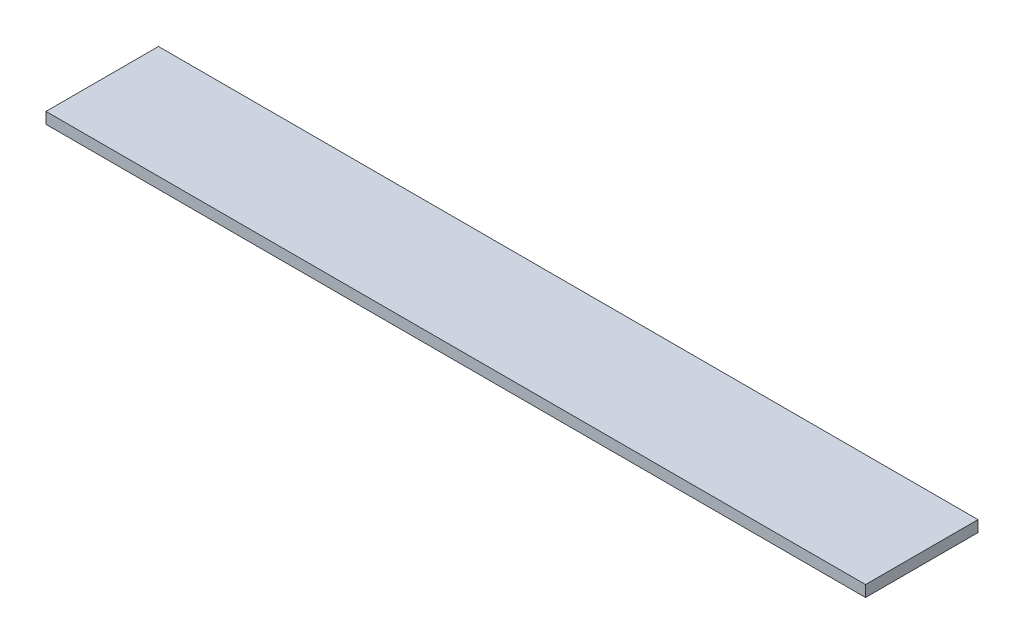
ISO-10303-21;
HEADER;
FILE_DESCRIPTION(('STEP AP214'),'2;1');
FILE_NAME('part.step','',(''),(''),'','','');
FILE_SCHEMA(('AUTOMOTIVE_DESIGN { 1 0 10303 214 1 1 1 1 }'));
ENDSEC;
DATA;
#1=APPLICATION_CONTEXT('core data for automotive mechanical design processes');
#2=APPLICATION_PROTOCOL_DEFINITION('international standard','automotive_design',2000,#1);
#3=PRODUCT_CONTEXT('',#1,'mechanical');
#4=PRODUCT('Part','Part','',(#3));
#5=PRODUCT_RELATED_PRODUCT_CATEGORY('part','',(#4));
#6=PRODUCT_DEFINITION_FORMATION('','',#4);
#7=PRODUCT_DEFINITION_CONTEXT('part definition',#1,'design');
#8=PRODUCT_DEFINITION('design','',#6,#7);
#9=PRODUCT_DEFINITION_SHAPE('','',#8);
#10=(LENGTH_UNIT() NAMED_UNIT(*) SI_UNIT(.MILLI.,.METRE.));
#11=(NAMED_UNIT(*) PLANE_ANGLE_UNIT() SI_UNIT($,.RADIAN.));
#12=(NAMED_UNIT(*) SI_UNIT($,.STERADIAN.) SOLID_ANGLE_UNIT());
#13=UNCERTAINTY_MEASURE_WITH_UNIT(LENGTH_MEASURE(1.E-05),#10,'distance_accuracy_value','');
#14=(GEOMETRIC_REPRESENTATION_CONTEXT(3) GLOBAL_UNCERTAINTY_ASSIGNED_CONTEXT((#13)) GLOBAL_UNIT_ASSIGNED_CONTEXT((#10,
#11,#12)) REPRESENTATION_CONTEXT('',''));
#15=CARTESIAN_POINT('',(0.,0.,0.));
#16=DIRECTION('',(0.,0.,1.));
#17=DIRECTION('',(1.,0.,0.));
#18=AXIS2_PLACEMENT_3D('',#15,#16,#17);
#19=CARTESIAN_POINT('',(-72.875,2.,10.));
#20=DIRECTION('',(1.,0.,0.));
#21=DIRECTION('',(0.,0.,-1.));
#22=AXIS2_PLACEMENT_3D('',#19,#20,#21);
#23=PLANE('',#22);
#24=DIRECTION('',(0.,0.,1.));
#25=VECTOR('',#24,1.);
#26=CARTESIAN_POINT('',(-72.875,0.,10.));
#27=LINE('',#26,#25);
#28=CARTESIAN_POINT('',(-72.875,0.,-9.99999999999999));
#29=VERTEX_POINT('',#28);
#30=CARTESIAN_POINT('',(-72.875,0.,10.));
#31=VERTEX_POINT('',#30);
#32=EDGE_CURVE('E99',#29,#31,#27,.T.);
#33=ORIENTED_EDGE('',*,*,#32,.T.);
#34=DIRECTION('',(0.,-1.,0.));
#35=VECTOR('',#34,1.);
#36=CARTESIAN_POINT('',(-72.875,2.,10.));
#37=LINE('',#36,#35);
#38=CARTESIAN_POINT('',(-72.875,2.,10.));
#39=VERTEX_POINT('',#38);
#40=EDGE_CURVE('E11',#39,#31,#37,.T.);
#41=ORIENTED_EDGE('',*,*,#40,.F.);
#42=DIRECTION('',(0.,0.,1.));
#43=VECTOR('',#42,1.);
#44=CARTESIAN_POINT('',(-72.875,2.,10.));
#45=LINE('',#44,#43);
#46=CARTESIAN_POINT('',(-72.875,2.,-9.99999999999999));
#47=VERTEX_POINT('',#46);
#48=EDGE_CURVE('E87',#47,#39,#45,.T.);
#49=ORIENTED_EDGE('',*,*,#48,.F.);
#50=DIRECTION('',(0.,-1.,0.));
#51=VECTOR('',#50,1.);
#52=CARTESIAN_POINT('',(-72.875,2.,-9.99999999999999));
#53=LINE('',#52,#51);
#54=EDGE_CURVE('E95',#47,#29,#53,.T.);
#55=ORIENTED_EDGE('',*,*,#54,.T.);
#56=EDGE_LOOP('',(#33,#41,#49,#55));
#57=FACE_BOUND('',#56,.T.);
#58=ADVANCED_FACE('F36',(#57),#23,.F.);
#59=CARTESIAN_POINT('',(72.875,2.,9.99999999999999));
#60=DIRECTION('',(0.,0.,-1.));
#61=DIRECTION('',(-1.,0.,0.));
#62=AXIS2_PLACEMENT_3D('',#59,#60,#61);
#63=PLANE('',#62);
#64=DIRECTION('',(1.,0.,0.));
#65=VECTOR('',#64,1.);
#66=CARTESIAN_POINT('',(72.875,0.,9.99999999999999));
#67=LINE('',#66,#65);
#68=CARTESIAN_POINT('',(72.875,0.,9.99999999999999));
#69=VERTEX_POINT('',#68);
#70=EDGE_CURVE('E91',#31,#69,#67,.T.);
#71=ORIENTED_EDGE('',*,*,#70,.T.);
#72=DIRECTION('',(0.,-1.,0.));
#73=VECTOR('',#72,1.);
#74=CARTESIAN_POINT('',(72.875,2.,9.99999999999999));
#75=LINE('',#74,#73);
#76=CARTESIAN_POINT('',(72.875,2.,9.99999999999999));
#77=VERTEX_POINT('',#76);
#78=EDGE_CURVE('E44',#77,#69,#75,.T.);
#79=ORIENTED_EDGE('',*,*,#78,.F.);
#80=DIRECTION('',(1.,0.,0.));
#81=VECTOR('',#80,1.);
#82=CARTESIAN_POINT('',(72.875,2.,9.99999999999999));
#83=LINE('',#82,#81);
#84=EDGE_CURVE('E82',#39,#77,#83,.T.);
#85=ORIENTED_EDGE('',*,*,#84,.F.);
#86=ORIENTED_EDGE('',*,*,#40,.T.);
#87=EDGE_LOOP('',(#71,#79,#85,#86));
#88=FACE_BOUND('',#87,.T.);
#89=ADVANCED_FACE('F90',(#88),#63,.F.);
#90=CARTESIAN_POINT('',(72.875,2.,9.99999999999999));
#91=DIRECTION('',(-1.,0.,0.));
#92=DIRECTION('',(0.,0.,1.));
#93=AXIS2_PLACEMENT_3D('',#90,#91,#92);
#94=PLANE('',#93);
#95=DIRECTION('',(0.,0.,-1.));
#96=VECTOR('',#95,1.);
#97=CARTESIAN_POINT('',(72.875,0.,9.99999999999999));
#98=LINE('',#97,#96);
#99=CARTESIAN_POINT('',(72.875,0.,-10.));
#100=VERTEX_POINT('',#99);
#101=EDGE_CURVE('E69',#69,#100,#98,.T.);
#102=ORIENTED_EDGE('',*,*,#101,.T.);
#103=DIRECTION('',(0.,-1.,0.));
#104=VECTOR('',#103,1.);
#105=CARTESIAN_POINT('',(72.875,2.,-10.));
#106=LINE('',#105,#104);
#107=CARTESIAN_POINT('',(72.875,2.,-10.));
#108=VERTEX_POINT('',#107);
#109=EDGE_CURVE('E92',#108,#100,#106,.T.);
#110=ORIENTED_EDGE('',*,*,#109,.F.);
#111=DIRECTION('',(0.,0.,-1.));
#112=VECTOR('',#111,1.);
#113=CARTESIAN_POINT('',(72.875,2.,9.99999999999999));
#114=LINE('',#113,#112);
#115=EDGE_CURVE('E85',#77,#108,#114,.T.);
#116=ORIENTED_EDGE('',*,*,#115,.F.);
#117=ORIENTED_EDGE('',*,*,#78,.T.);
#118=EDGE_LOOP('',(#102,#110,#116,#117));
#119=FACE_BOUND('',#118,.T.);
#120=ADVANCED_FACE('F93',(#119),#94,.F.);
#121=CARTESIAN_POINT('',(72.875,2.,-10.));
#122=DIRECTION('',(0.,0.,1.));
#123=DIRECTION('',(1.,0.,0.));
#124=AXIS2_PLACEMENT_3D('',#121,#122,#123);
#125=PLANE('',#124);
#126=DIRECTION('',(-1.,0.,0.));
#127=VECTOR('',#126,1.);
#128=CARTESIAN_POINT('',(72.875,0.,-10.));
#129=LINE('',#128,#127);
#130=EDGE_CURVE('E75',#100,#29,#129,.T.);
#131=ORIENTED_EDGE('',*,*,#130,.T.);
#132=ORIENTED_EDGE('',*,*,#54,.F.);
#133=DIRECTION('',(-1.,0.,0.));
#134=VECTOR('',#133,1.);
#135=CARTESIAN_POINT('',(72.875,2.,-10.));
#136=LINE('',#135,#134);
#137=EDGE_CURVE('E52',#108,#47,#136,.T.);
#138=ORIENTED_EDGE('',*,*,#137,.F.);
#139=ORIENTED_EDGE('',*,*,#109,.T.);
#140=EDGE_LOOP('',(#131,#132,#138,#139));
#141=FACE_BOUND('',#140,.T.);
#142=ADVANCED_FACE('F106',(#141),#125,.F.);
#143=CARTESIAN_POINT('',(0.,2.,0.));
#144=DIRECTION('',(0.,1.,0.));
#145=DIRECTION('',(0.,0.,1.));
#146=AXIS2_PLACEMENT_3D('',#143,#144,#145);
#147=PLANE('',#146);
#148=ORIENTED_EDGE('',*,*,#48,.T.);
#149=ORIENTED_EDGE('',*,*,#84,.T.);
#150=ORIENTED_EDGE('',*,*,#115,.T.);
#151=ORIENTED_EDGE('',*,*,#137,.T.);
#152=EDGE_LOOP('',(#148,#149,#150,#151));
#153=FACE_BOUND('',#152,.T.);
#154=ADVANCED_FACE('F83',(#153),#147,.T.);
#155=CARTESIAN_POINT('',(0.,0.,0.));
#156=DIRECTION('',(0.,1.,0.));
#157=DIRECTION('',(0.,0.,1.));
#158=AXIS2_PLACEMENT_3D('',#155,#156,#157);
#159=PLANE('',#158);
#160=ORIENTED_EDGE('',*,*,#32,.F.);
#161=ORIENTED_EDGE('',*,*,#130,.F.);
#162=ORIENTED_EDGE('',*,*,#101,.F.);
#163=ORIENTED_EDGE('',*,*,#70,.F.);
#164=EDGE_LOOP('',(#160,#161,#162,#163));
#165=FACE_BOUND('',#164,.T.);
#166=ADVANCED_FACE('F109',(#165),#159,.F.);
#167=CLOSED_SHELL('',(#58,#89,#120,#142,#154,#166));
#168=MANIFOLD_SOLID_BREP('B2',#167);
#169=ADVANCED_BREP_SHAPE_REPRESENTATION('',(#18,#168),#14);
#170=SHAPE_DEFINITION_REPRESENTATION(#9,#169);
ENDSEC;
END-ISO-10303-21;
